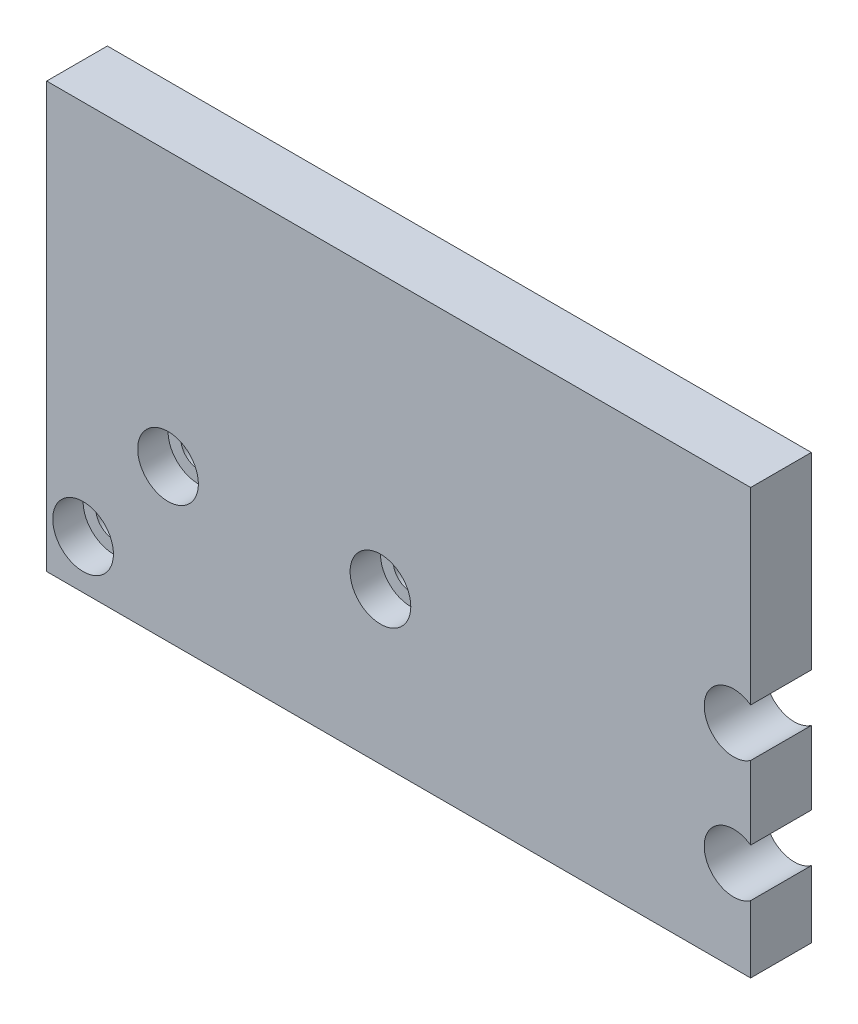
ISO-10303-21;
HEADER;
FILE_DESCRIPTION(('STEP AP214'),'2;1');
FILE_NAME('part.step','',(''),(''),'','','');
FILE_SCHEMA(('AUTOMOTIVE_DESIGN { 1 0 10303 214 1 1 1 1 }'));
ENDSEC;
DATA;
#1=APPLICATION_CONTEXT('core data for automotive mechanical design processes');
#2=APPLICATION_PROTOCOL_DEFINITION('international standard','automotive_design',2000,#1);
#3=PRODUCT_CONTEXT('',#1,'mechanical');
#4=PRODUCT('Part','Part','',(#3));
#5=PRODUCT_RELATED_PRODUCT_CATEGORY('part','',(#4));
#6=PRODUCT_DEFINITION_FORMATION('','',#4);
#7=PRODUCT_DEFINITION_CONTEXT('part definition',#1,'design');
#8=PRODUCT_DEFINITION('design','',#6,#7);
#9=PRODUCT_DEFINITION_SHAPE('','',#8);
#10=(LENGTH_UNIT() NAMED_UNIT(*) SI_UNIT(.MILLI.,.METRE.));
#11=(NAMED_UNIT(*) PLANE_ANGLE_UNIT() SI_UNIT($,.RADIAN.));
#12=(NAMED_UNIT(*) SI_UNIT($,.STERADIAN.) SOLID_ANGLE_UNIT());
#13=UNCERTAINTY_MEASURE_WITH_UNIT(LENGTH_MEASURE(1.E-05),#10,'distance_accuracy_value','');
#14=(GEOMETRIC_REPRESENTATION_CONTEXT(3) GLOBAL_UNCERTAINTY_ASSIGNED_CONTEXT((#13)) GLOBAL_UNIT_ASSIGNED_CONTEXT((#10,
#11,#12)) REPRESENTATION_CONTEXT('',''));
#15=CARTESIAN_POINT('',(0.,0.,0.));
#16=DIRECTION('',(0.,0.,1.));
#17=DIRECTION('',(1.,0.,0.));
#18=AXIS2_PLACEMENT_3D('',#15,#16,#17);
#19=CARTESIAN_POINT('',(116.,0.,10.));
#20=DIRECTION('',(-1.,0.,0.));
#21=DIRECTION('',(0.,0.,1.));
#22=AXIS2_PLACEMENT_3D('',#19,#20,#21);
#23=PLANE('',#22);
#24=DIRECTION('',(0.,1.,0.));
#25=VECTOR('',#24,1.);
#26=CARTESIAN_POINT('',(116.,0.,0.));
#27=LINE('',#26,#25);
#28=CARTESIAN_POINT('',(116.,0.,0.));
#29=VERTEX_POINT('',#28);
#30=CARTESIAN_POINT('',(116.,11.0398863652668,0.));
#31=VERTEX_POINT('',#30);
#32=EDGE_CURVE('E114',#29,#31,#27,.T.);
#33=ORIENTED_EDGE('',*,*,#32,.T.);
#34=DIRECTION('',(0.,0.,1.));
#35=VECTOR('',#34,1.);
#36=CARTESIAN_POINT('',(116.,11.0398863652668,0.));
#37=LINE('',#36,#35);
#38=CARTESIAN_POINT('',(116.,11.0398863652668,10.));
#39=VERTEX_POINT('',#38);
#40=EDGE_CURVE('E48',#31,#39,#37,.T.);
#41=ORIENTED_EDGE('',*,*,#40,.T.);
#42=DIRECTION('',(0.,1.,0.));
#43=VECTOR('',#42,1.);
#44=CARTESIAN_POINT('',(116.,0.,10.));
#45=LINE('',#44,#43);
#46=CARTESIAN_POINT('',(116.,0.,10.));
#47=VERTEX_POINT('',#46);
#48=EDGE_CURVE('E135',#47,#39,#45,.T.);
#49=ORIENTED_EDGE('',*,*,#48,.F.);
#50=DIRECTION('',(0.,0.,-1.));
#51=VECTOR('',#50,1.);
#52=CARTESIAN_POINT('',(116.,0.,10.));
#53=LINE('',#52,#51);
#54=EDGE_CURVE('E41',#47,#29,#53,.T.);
#55=ORIENTED_EDGE('',*,*,#54,.T.);
#56=EDGE_LOOP('',(#33,#41,#49,#55));
#57=FACE_BOUND('',#56,.T.);
#58=ADVANCED_FACE('F33',(#57),#23,.F.);
#59=CARTESIAN_POINT('',(116.,18.9601136347332,10.));
#60=VERTEX_POINT('',#59);
#61=CARTESIAN_POINT('',(116.,31.0398863652668,10.));
#62=VERTEX_POINT('',#61);
#63=EDGE_CURVE('E108',#60,#62,#45,.T.);
#64=ORIENTED_EDGE('',*,*,#63,.F.);
#65=DIRECTION('',(0.,0.,1.));
#66=VECTOR('',#65,1.);
#67=CARTESIAN_POINT('',(116.,18.9601136347332,0.));
#68=LINE('',#67,#66);
#69=CARTESIAN_POINT('',(116.,18.9601136347332,0.));
#70=VERTEX_POINT('',#69);
#71=EDGE_CURVE('E99',#60,#70,#68,.F.);
#72=ORIENTED_EDGE('',*,*,#71,.T.);
#73=CARTESIAN_POINT('',(116.,31.0398863652668,0.));
#74=VERTEX_POINT('',#73);
#75=EDGE_CURVE('E56',#70,#74,#27,.T.);
#76=ORIENTED_EDGE('',*,*,#75,.T.);
#77=DIRECTION('',(0.,0.,1.));
#78=VECTOR('',#77,1.);
#79=CARTESIAN_POINT('',(116.,31.0398863652668,0.));
#80=LINE('',#79,#78);
#81=EDGE_CURVE('E148',#74,#62,#80,.T.);
#82=ORIENTED_EDGE('',*,*,#81,.T.);
#83=EDGE_LOOP('',(#64,#72,#76,#82));
#84=FACE_BOUND('',#83,.T.);
#85=ADVANCED_FACE('F107',(#84),#23,.F.);
#86=CARTESIAN_POINT('',(0.,0.,10.));
#87=DIRECTION('',(1.,0.,0.));
#88=DIRECTION('',(0.,0.,-1.));
#89=AXIS2_PLACEMENT_3D('',#86,#87,#88);
#90=PLANE('',#89);
#91=DIRECTION('',(0.,-1.,0.));
#92=VECTOR('',#91,1.);
#93=CARTESIAN_POINT('',(0.,0.,0.));
#94=LINE('',#93,#92);
#95=CARTESIAN_POINT('',(0.,70.,0.));
#96=VERTEX_POINT('',#95);
#97=CARTESIAN_POINT('',(0.,0.,0.));
#98=VERTEX_POINT('',#97);
#99=EDGE_CURVE('E140',#96,#98,#94,.T.);
#100=ORIENTED_EDGE('',*,*,#99,.T.);
#101=DIRECTION('',(0.,0.,-1.));
#102=VECTOR('',#101,1.);
#103=CARTESIAN_POINT('',(0.,0.,10.));
#104=LINE('',#103,#102);
#105=CARTESIAN_POINT('',(0.,0.,10.));
#106=VERTEX_POINT('',#105);
#107=EDGE_CURVE('E11',#106,#98,#104,.T.);
#108=ORIENTED_EDGE('',*,*,#107,.F.);
#109=DIRECTION('',(0.,-1.,0.));
#110=VECTOR('',#109,1.);
#111=CARTESIAN_POINT('',(0.,0.,10.));
#112=LINE('',#111,#110);
#113=CARTESIAN_POINT('',(0.,70.,10.));
#114=VERTEX_POINT('',#113);
#115=EDGE_CURVE('E123',#114,#106,#112,.T.);
#116=ORIENTED_EDGE('',*,*,#115,.F.);
#117=DIRECTION('',(0.,0.,-1.));
#118=VECTOR('',#117,1.);
#119=CARTESIAN_POINT('',(0.,70.,10.));
#120=LINE('',#119,#118);
#121=EDGE_CURVE('E124',#114,#96,#120,.T.);
#122=ORIENTED_EDGE('',*,*,#121,.T.);
#123=EDGE_LOOP('',(#100,#108,#116,#122));
#124=FACE_BOUND('',#123,.T.);
#125=ADVANCED_FACE('F35',(#124),#90,.F.);
#126=CARTESIAN_POINT('',(0.,0.,10.));
#127=DIRECTION('',(0.,1.,0.));
#128=DIRECTION('',(0.,0.,1.));
#129=AXIS2_PLACEMENT_3D('',#126,#127,#128);
#130=PLANE('',#129);
#131=DIRECTION('',(1.,0.,0.));
#132=VECTOR('',#131,1.);
#133=CARTESIAN_POINT('',(0.,0.,0.));
#134=LINE('',#133,#132);
#135=EDGE_CURVE('E118',#98,#29,#134,.T.);
#136=ORIENTED_EDGE('',*,*,#135,.T.);
#137=ORIENTED_EDGE('',*,*,#54,.F.);
#138=DIRECTION('',(1.,0.,0.));
#139=VECTOR('',#138,1.);
#140=CARTESIAN_POINT('',(0.,0.,10.));
#141=LINE('',#140,#139);
#142=EDGE_CURVE('E143',#106,#47,#141,.T.);
#143=ORIENTED_EDGE('',*,*,#142,.F.);
#144=ORIENTED_EDGE('',*,*,#107,.T.);
#145=EDGE_LOOP('',(#136,#137,#143,#144));
#146=FACE_BOUND('',#145,.T.);
#147=ADVANCED_FACE('F142',(#146),#130,.F.);
#148=CARTESIAN_POINT('',(116.,38.9601136347332,10.));
#149=VERTEX_POINT('',#148);
#150=CARTESIAN_POINT('',(116.,70.,10.));
#151=VERTEX_POINT('',#150);
#152=EDGE_CURVE('E154',#149,#151,#45,.T.);
#153=ORIENTED_EDGE('',*,*,#152,.F.);
#154=DIRECTION('',(0.,0.,1.));
#155=VECTOR('',#154,1.);
#156=CARTESIAN_POINT('',(116.,38.9601136347332,0.));
#157=LINE('',#156,#155);
#158=CARTESIAN_POINT('',(116.,38.9601136347332,0.));
#159=VERTEX_POINT('',#158);
#160=EDGE_CURVE('E149',#149,#159,#157,.F.);
#161=ORIENTED_EDGE('',*,*,#160,.T.);
#162=CARTESIAN_POINT('',(116.,70.,0.));
#163=VERTEX_POINT('',#162);
#164=EDGE_CURVE('E115',#159,#163,#27,.T.);
#165=ORIENTED_EDGE('',*,*,#164,.T.);
#166=DIRECTION('',(0.,0.,-1.));
#167=VECTOR('',#166,1.);
#168=CARTESIAN_POINT('',(116.,70.,10.));
#169=LINE('',#168,#167);
#170=EDGE_CURVE('E127',#151,#163,#169,.T.);
#171=ORIENTED_EDGE('',*,*,#170,.F.);
#172=EDGE_LOOP('',(#153,#161,#165,#171));
#173=FACE_BOUND('',#172,.T.);
#174=ADVANCED_FACE('F219',(#173),#23,.F.);
#175=CARTESIAN_POINT('',(0.,70.,10.));
#176=DIRECTION('',(0.,-1.,0.));
#177=DIRECTION('',(0.,0.,-1.));
#178=AXIS2_PLACEMENT_3D('',#175,#176,#177);
#179=PLANE('',#178);
#180=DIRECTION('',(-1.,0.,0.));
#181=VECTOR('',#180,1.);
#182=CARTESIAN_POINT('',(0.,70.,0.));
#183=LINE('',#182,#181);
#184=EDGE_CURVE('E117',#163,#96,#183,.T.);
#185=ORIENTED_EDGE('',*,*,#184,.T.);
#186=ORIENTED_EDGE('',*,*,#121,.F.);
#187=DIRECTION('',(-1.,0.,0.));
#188=VECTOR('',#187,1.);
#189=CARTESIAN_POINT('',(0.,70.,10.));
#190=LINE('',#189,#188);
#191=EDGE_CURVE('E128',#151,#114,#190,.T.);
#192=ORIENTED_EDGE('',*,*,#191,.F.);
#193=ORIENTED_EDGE('',*,*,#170,.T.);
#194=EDGE_LOOP('',(#185,#186,#192,#193));
#195=FACE_BOUND('',#194,.T.);
#196=ADVANCED_FACE('F207',(#195),#179,.F.);
#197=CARTESIAN_POINT('',(0.,70.,10.));
#198=DIRECTION('',(0.,0.,-1.));
#199=DIRECTION('',(-1.,0.,0.));
#200=AXIS2_PLACEMENT_3D('',#197,#198,#199);
#201=PLANE('',#200);
#202=CARTESIAN_POINT('',(6.,8.,10.));
#203=DIRECTION('',(0.,0.,1.));
#204=DIRECTION('',(1.,0.,0.));
#205=AXIS2_PLACEMENT_3D('',#202,#203,#204);
#206=CIRCLE('',#205,5.);
#207=CARTESIAN_POINT('',(11.,8.,10.));
#208=VERTEX_POINT('',#207);
#209=EDGE_CURVE('E198',#208,#208,#206,.T.);
#210=ORIENTED_EDGE('',*,*,#209,.F.);
#211=EDGE_LOOP('',(#210));
#212=FACE_BOUND('',#211,.T.);
#213=CARTESIAN_POINT('',(20.,25.,10.));
#214=DIRECTION('',(0.,0.,1.));
#215=DIRECTION('',(1.,0.,0.));
#216=AXIS2_PLACEMENT_3D('',#213,#214,#215);
#217=CIRCLE('',#216,5.);
#218=CARTESIAN_POINT('',(25.,25.,10.));
#219=VERTEX_POINT('',#218);
#220=EDGE_CURVE('E186',#219,#219,#217,.T.);
#221=ORIENTED_EDGE('',*,*,#220,.F.);
#222=EDGE_LOOP('',(#221));
#223=FACE_BOUND('',#222,.T.);
#224=CARTESIAN_POINT('',(55.,25.,10.));
#225=DIRECTION('',(0.,0.,1.));
#226=DIRECTION('',(1.,0.,0.));
#227=AXIS2_PLACEMENT_3D('',#224,#225,#226);
#228=CIRCLE('',#227,5.);
#229=CARTESIAN_POINT('',(60.,25.,10.));
#230=VERTEX_POINT('',#229);
#231=EDGE_CURVE('E174',#230,#230,#228,.T.);
#232=ORIENTED_EDGE('',*,*,#231,.F.);
#233=EDGE_LOOP('',(#232));
#234=FACE_BOUND('',#233,.T.);
#235=ORIENTED_EDGE('',*,*,#48,.T.);
#236=CARTESIAN_POINT('',(113.2,15.,10.));
#237=DIRECTION('',(0.,0.,1.));
#238=DIRECTION('',(1.,0.,0.));
#239=AXIS2_PLACEMENT_3D('',#236,#237,#238);
#240=CIRCLE('',#239,4.85);
#241=EDGE_CURVE('E104',#60,#39,#240,.T.);
#242=ORIENTED_EDGE('',*,*,#241,.F.);
#243=ORIENTED_EDGE('',*,*,#63,.T.);
#244=CARTESIAN_POINT('',(113.2,35.,10.));
#245=DIRECTION('',(0.,0.,1.));
#246=DIRECTION('',(1.,0.,0.));
#247=AXIS2_PLACEMENT_3D('',#244,#245,#246);
#248=CIRCLE('',#247,4.85);
#249=EDGE_CURVE('E159',#149,#62,#248,.T.);
#250=ORIENTED_EDGE('',*,*,#249,.F.);
#251=ORIENTED_EDGE('',*,*,#152,.T.);
#252=ORIENTED_EDGE('',*,*,#191,.T.);
#253=ORIENTED_EDGE('',*,*,#115,.T.);
#254=ORIENTED_EDGE('',*,*,#142,.T.);
#255=EDGE_LOOP('',(#235,#242,#243,#250,#251,#252,#253,#254));
#256=FACE_BOUND('',#255,.T.);
#257=ADVANCED_FACE('F204',(#212,#223,#234,#256),#201,.F.);
#258=CARTESIAN_POINT('',(0.,70.,0.));
#259=DIRECTION('',(0.,0.,-1.));
#260=DIRECTION('',(-1.,0.,0.));
#261=AXIS2_PLACEMENT_3D('',#258,#259,#260);
#262=PLANE('',#261);
#263=CARTESIAN_POINT('',(6.,8.,0.));
#264=DIRECTION('',(0.,0.,1.));
#265=DIRECTION('',(1.,0.,0.));
#266=AXIS2_PLACEMENT_3D('',#263,#264,#265);
#267=CIRCLE('',#266,2.9);
#268=CARTESIAN_POINT('',(8.9,8.,0.));
#269=VERTEX_POINT('',#268);
#270=EDGE_CURVE('E189',#269,#269,#267,.T.);
#271=ORIENTED_EDGE('',*,*,#270,.T.);
#272=EDGE_LOOP('',(#271));
#273=FACE_BOUND('',#272,.T.);
#274=CARTESIAN_POINT('',(20.,25.,0.));
#275=DIRECTION('',(0.,0.,1.));
#276=DIRECTION('',(1.,0.,0.));
#277=AXIS2_PLACEMENT_3D('',#274,#275,#276);
#278=CIRCLE('',#277,2.9);
#279=CARTESIAN_POINT('',(22.9,25.,0.));
#280=VERTEX_POINT('',#279);
#281=EDGE_CURVE('E177',#280,#280,#278,.T.);
#282=ORIENTED_EDGE('',*,*,#281,.T.);
#283=EDGE_LOOP('',(#282));
#284=FACE_BOUND('',#283,.T.);
#285=CARTESIAN_POINT('',(55.,25.,0.));
#286=DIRECTION('',(0.,0.,1.));
#287=DIRECTION('',(1.,0.,0.));
#288=AXIS2_PLACEMENT_3D('',#285,#286,#287);
#289=CIRCLE('',#288,2.9);
#290=CARTESIAN_POINT('',(57.9,25.,0.));
#291=VERTEX_POINT('',#290);
#292=EDGE_CURVE('E164',#291,#291,#289,.T.);
#293=ORIENTED_EDGE('',*,*,#292,.T.);
#294=EDGE_LOOP('',(#293));
#295=FACE_BOUND('',#294,.T.);
#296=CARTESIAN_POINT('',(113.2,15.,0.));
#297=DIRECTION('',(0.,0.,1.));
#298=DIRECTION('',(1.,0.,0.));
#299=AXIS2_PLACEMENT_3D('',#296,#297,#298);
#300=CIRCLE('',#299,4.85);
#301=EDGE_CURVE('E97',#70,#31,#300,.T.);
#302=ORIENTED_EDGE('',*,*,#301,.T.);
#303=ORIENTED_EDGE('',*,*,#32,.F.);
#304=ORIENTED_EDGE('',*,*,#135,.F.);
#305=ORIENTED_EDGE('',*,*,#99,.F.);
#306=ORIENTED_EDGE('',*,*,#184,.F.);
#307=ORIENTED_EDGE('',*,*,#164,.F.);
#308=CARTESIAN_POINT('',(113.2,35.,0.));
#309=DIRECTION('',(0.,0.,1.));
#310=DIRECTION('',(1.,0.,0.));
#311=AXIS2_PLACEMENT_3D('',#308,#309,#310);
#312=CIRCLE('',#311,4.85);
#313=EDGE_CURVE('E113',#159,#74,#312,.T.);
#314=ORIENTED_EDGE('',*,*,#313,.T.);
#315=ORIENTED_EDGE('',*,*,#75,.F.);
#316=EDGE_LOOP('',(#302,#303,#304,#305,#306,#307,#314,#315));
#317=FACE_BOUND('',#316,.T.);
#318=ADVANCED_FACE('F111',(#273,#284,#295,#317),#262,.T.);
#319=CARTESIAN_POINT('',(113.2,35.,0.));
#320=DIRECTION('',(0.,0.,1.));
#321=DIRECTION('',(1.,0.,0.));
#322=AXIS2_PLACEMENT_3D('',#319,#320,#321);
#323=CYLINDRICAL_SURFACE('',#322,4.85);
#324=ORIENTED_EDGE('',*,*,#313,.F.);
#325=ORIENTED_EDGE('',*,*,#160,.F.);
#326=ORIENTED_EDGE('',*,*,#249,.T.);
#327=ORIENTED_EDGE('',*,*,#81,.F.);
#328=EDGE_LOOP('',(#324,#325,#326,#327));
#329=FACE_BOUND('',#328,.T.);
#330=ADVANCED_FACE('F221',(#329),#323,.F.);
#331=CARTESIAN_POINT('',(113.2,15.,0.));
#332=DIRECTION('',(0.,0.,1.));
#333=DIRECTION('',(1.,0.,0.));
#334=AXIS2_PLACEMENT_3D('',#331,#332,#333);
#335=CYLINDRICAL_SURFACE('',#334,4.85);
#336=ORIENTED_EDGE('',*,*,#301,.F.);
#337=ORIENTED_EDGE('',*,*,#71,.F.);
#338=ORIENTED_EDGE('',*,*,#241,.T.);
#339=ORIENTED_EDGE('',*,*,#40,.F.);
#340=EDGE_LOOP('',(#336,#337,#338,#339));
#341=FACE_BOUND('',#340,.T.);
#342=ADVANCED_FACE('F98',(#341),#335,.F.);
#343=CARTESIAN_POINT('',(55.,25.,10.));
#344=DIRECTION('',(0.,0.,1.));
#345=DIRECTION('',(1.,0.,0.));
#346=AXIS2_PLACEMENT_3D('',#343,#344,#345);
#347=CYLINDRICAL_SURFACE('',#346,2.9);
#348=ORIENTED_EDGE('',*,*,#292,.F.);
#349=EDGE_LOOP('',(#348));
#350=FACE_BOUND('',#349,.T.);
#351=CARTESIAN_POINT('',(55.,25.,5.));
#352=DIRECTION('',(0.,0.,1.));
#353=DIRECTION('',(1.,0.,0.));
#354=AXIS2_PLACEMENT_3D('',#351,#352,#353);
#355=CIRCLE('',#354,2.9);
#356=CARTESIAN_POINT('',(57.9,25.,5.));
#357=VERTEX_POINT('',#356);
#358=EDGE_CURVE('E168',#357,#357,#355,.T.);
#359=ORIENTED_EDGE('',*,*,#358,.T.);
#360=EDGE_LOOP('',(#359));
#361=FACE_BOUND('',#360,.T.);
#362=ADVANCED_FACE('F228',(#350,#361),#347,.F.);
#363=CARTESIAN_POINT('',(57.9,25.,5.));
#364=DIRECTION('',(0.,0.,-1.));
#365=DIRECTION('',(-1.,0.,0.));
#366=AXIS2_PLACEMENT_3D('',#363,#364,#365);
#367=PLANE('',#366);
#368=ORIENTED_EDGE('',*,*,#358,.F.);
#369=EDGE_LOOP('',(#368));
#370=FACE_BOUND('',#369,.T.);
#371=CARTESIAN_POINT('',(55.,25.,5.));
#372=DIRECTION('',(0.,0.,1.));
#373=DIRECTION('',(1.,0.,0.));
#374=AXIS2_PLACEMENT_3D('',#371,#372,#373);
#375=CIRCLE('',#374,5.);
#376=CARTESIAN_POINT('',(60.,25.,5.));
#377=VERTEX_POINT('',#376);
#378=EDGE_CURVE('E171',#377,#377,#375,.T.);
#379=ORIENTED_EDGE('',*,*,#378,.T.);
#380=EDGE_LOOP('',(#379));
#381=FACE_BOUND('',#380,.T.);
#382=ADVANCED_FACE('F292',(#370,#381),#367,.F.);
#383=CARTESIAN_POINT('',(55.,25.,10.));
#384=DIRECTION('',(0.,0.,1.));
#385=DIRECTION('',(1.,0.,0.));
#386=AXIS2_PLACEMENT_3D('',#383,#384,#385);
#387=CYLINDRICAL_SURFACE('',#386,5.);
#388=ORIENTED_EDGE('',*,*,#378,.F.);
#389=EDGE_LOOP('',(#388));
#390=FACE_BOUND('',#389,.T.);
#391=ORIENTED_EDGE('',*,*,#231,.T.);
#392=EDGE_LOOP('',(#391));
#393=FACE_BOUND('',#392,.T.);
#394=ADVANCED_FACE('F302',(#390,#393),#387,.F.);
#395=CARTESIAN_POINT('',(20.,25.,10.));
#396=DIRECTION('',(0.,0.,1.));
#397=DIRECTION('',(1.,0.,0.));
#398=AXIS2_PLACEMENT_3D('',#395,#396,#397);
#399=CYLINDRICAL_SURFACE('',#398,2.9);
#400=ORIENTED_EDGE('',*,*,#281,.F.);
#401=EDGE_LOOP('',(#400));
#402=FACE_BOUND('',#401,.T.);
#403=CARTESIAN_POINT('',(20.,25.,5.));
#404=DIRECTION('',(0.,0.,1.));
#405=DIRECTION('',(1.,0.,0.));
#406=AXIS2_PLACEMENT_3D('',#403,#404,#405);
#407=CIRCLE('',#406,2.9);
#408=CARTESIAN_POINT('',(22.9,25.,5.));
#409=VERTEX_POINT('',#408);
#410=EDGE_CURVE('E180',#409,#409,#407,.T.);
#411=ORIENTED_EDGE('',*,*,#410,.T.);
#412=EDGE_LOOP('',(#411));
#413=FACE_BOUND('',#412,.T.);
#414=ADVANCED_FACE('F312',(#402,#413),#399,.F.);
#415=CARTESIAN_POINT('',(22.9,25.,5.));
#416=DIRECTION('',(0.,0.,-1.));
#417=DIRECTION('',(-1.,0.,0.));
#418=AXIS2_PLACEMENT_3D('',#415,#416,#417);
#419=PLANE('',#418);
#420=ORIENTED_EDGE('',*,*,#410,.F.);
#421=EDGE_LOOP('',(#420));
#422=FACE_BOUND('',#421,.T.);
#423=CARTESIAN_POINT('',(20.,25.,5.));
#424=DIRECTION('',(0.,0.,1.));
#425=DIRECTION('',(1.,0.,0.));
#426=AXIS2_PLACEMENT_3D('',#423,#424,#425);
#427=CIRCLE('',#426,5.);
#428=CARTESIAN_POINT('',(25.,25.,5.));
#429=VERTEX_POINT('',#428);
#430=EDGE_CURVE('E183',#429,#429,#427,.T.);
#431=ORIENTED_EDGE('',*,*,#430,.T.);
#432=EDGE_LOOP('',(#431));
#433=FACE_BOUND('',#432,.T.);
#434=ADVANCED_FACE('F322',(#422,#433),#419,.F.);
#435=CARTESIAN_POINT('',(20.,25.,10.));
#436=DIRECTION('',(0.,0.,1.));
#437=DIRECTION('',(1.,0.,0.));
#438=AXIS2_PLACEMENT_3D('',#435,#436,#437);
#439=CYLINDRICAL_SURFACE('',#438,5.);
#440=ORIENTED_EDGE('',*,*,#430,.F.);
#441=EDGE_LOOP('',(#440));
#442=FACE_BOUND('',#441,.T.);
#443=ORIENTED_EDGE('',*,*,#220,.T.);
#444=EDGE_LOOP('',(#443));
#445=FACE_BOUND('',#444,.T.);
#446=ADVANCED_FACE('F332',(#442,#445),#439,.F.);
#447=CARTESIAN_POINT('',(6.,8.,10.));
#448=DIRECTION('',(0.,0.,1.));
#449=DIRECTION('',(1.,0.,0.));
#450=AXIS2_PLACEMENT_3D('',#447,#448,#449);
#451=CYLINDRICAL_SURFACE('',#450,2.9);
#452=ORIENTED_EDGE('',*,*,#270,.F.);
#453=EDGE_LOOP('',(#452));
#454=FACE_BOUND('',#453,.T.);
#455=CARTESIAN_POINT('',(6.,8.,5.));
#456=DIRECTION('',(0.,0.,1.));
#457=DIRECTION('',(1.,0.,0.));
#458=AXIS2_PLACEMENT_3D('',#455,#456,#457);
#459=CIRCLE('',#458,2.9);
#460=CARTESIAN_POINT('',(8.9,8.,5.));
#461=VERTEX_POINT('',#460);
#462=EDGE_CURVE('E192',#461,#461,#459,.T.);
#463=ORIENTED_EDGE('',*,*,#462,.T.);
#464=EDGE_LOOP('',(#463));
#465=FACE_BOUND('',#464,.T.);
#466=ADVANCED_FACE('F342',(#454,#465),#451,.F.);
#467=CARTESIAN_POINT('',(8.9,8.,5.));
#468=DIRECTION('',(0.,0.,-1.));
#469=DIRECTION('',(-1.,0.,0.));
#470=AXIS2_PLACEMENT_3D('',#467,#468,#469);
#471=PLANE('',#470);
#472=ORIENTED_EDGE('',*,*,#462,.F.);
#473=EDGE_LOOP('',(#472));
#474=FACE_BOUND('',#473,.T.);
#475=CARTESIAN_POINT('',(6.,8.,5.));
#476=DIRECTION('',(0.,0.,1.));
#477=DIRECTION('',(1.,0.,0.));
#478=AXIS2_PLACEMENT_3D('',#475,#476,#477);
#479=CIRCLE('',#478,5.);
#480=CARTESIAN_POINT('',(11.,8.,5.));
#481=VERTEX_POINT('',#480);
#482=EDGE_CURVE('E195',#481,#481,#479,.T.);
#483=ORIENTED_EDGE('',*,*,#482,.T.);
#484=EDGE_LOOP('',(#483));
#485=FACE_BOUND('',#484,.T.);
#486=ADVANCED_FACE('F352',(#474,#485),#471,.F.);
#487=CARTESIAN_POINT('',(6.,8.,10.));
#488=DIRECTION('',(0.,0.,1.));
#489=DIRECTION('',(1.,0.,0.));
#490=AXIS2_PLACEMENT_3D('',#487,#488,#489);
#491=CYLINDRICAL_SURFACE('',#490,5.);
#492=ORIENTED_EDGE('',*,*,#482,.F.);
#493=EDGE_LOOP('',(#492));
#494=FACE_BOUND('',#493,.T.);
#495=ORIENTED_EDGE('',*,*,#209,.T.);
#496=EDGE_LOOP('',(#495));
#497=FACE_BOUND('',#496,.T.);
#498=ADVANCED_FACE('F202',(#494,#497),#491,.F.);
#499=CLOSED_SHELL('',(#58,#85,#125,#147,#174,#196,#257,#318,#330,#342,#362,#382,#394,#414,#434,
#446,#466,#486,#498));
#500=MANIFOLD_SOLID_BREP('B2',#499);
#501=ADVANCED_BREP_SHAPE_REPRESENTATION('',(#18,#500),#14);
#502=SHAPE_DEFINITION_REPRESENTATION(#9,#501);
ENDSEC;
END-ISO-10303-21;
